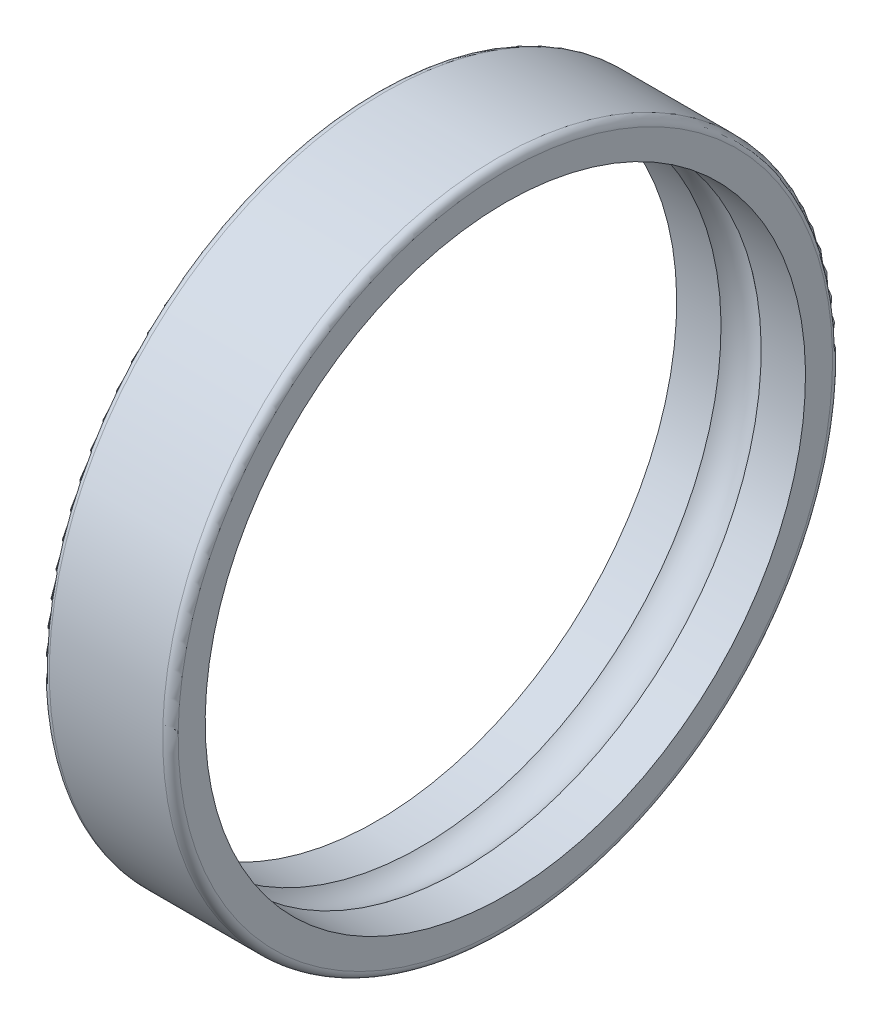
ISO-10303-21;
HEADER;
FILE_DESCRIPTION(('STEP AP214'),'2;1');
FILE_NAME('part.step','',(''),(''),'','','');
FILE_SCHEMA(('AUTOMOTIVE_DESIGN { 1 0 10303 214 1 1 1 1 }'));
ENDSEC;
DATA;
#1=APPLICATION_CONTEXT('core data for automotive mechanical design processes');
#2=APPLICATION_PROTOCOL_DEFINITION('international standard','automotive_design',2000,#1);
#3=PRODUCT_CONTEXT('',#1,'mechanical');
#4=PRODUCT('Part','Part','',(#3));
#5=PRODUCT_RELATED_PRODUCT_CATEGORY('part','',(#4));
#6=PRODUCT_DEFINITION_FORMATION('','',#4);
#7=PRODUCT_DEFINITION_CONTEXT('part definition',#1,'design');
#8=PRODUCT_DEFINITION('design','',#6,#7);
#9=PRODUCT_DEFINITION_SHAPE('','',#8);
#10=(LENGTH_UNIT() NAMED_UNIT(*) SI_UNIT(.MILLI.,.METRE.));
#11=(NAMED_UNIT(*) PLANE_ANGLE_UNIT() SI_UNIT($,.RADIAN.));
#12=(NAMED_UNIT(*) SI_UNIT($,.STERADIAN.) SOLID_ANGLE_UNIT());
#13=UNCERTAINTY_MEASURE_WITH_UNIT(LENGTH_MEASURE(1.E-05),#10,'distance_accuracy_value','');
#14=(GEOMETRIC_REPRESENTATION_CONTEXT(3) GLOBAL_UNCERTAINTY_ASSIGNED_CONTEXT((#13)) GLOBAL_UNIT_ASSIGNED_CONTEXT((#10,
#11,#12)) REPRESENTATION_CONTEXT('',''));
#15=CARTESIAN_POINT('',(0.,0.,0.));
#16=DIRECTION('',(0.,0.,1.));
#17=DIRECTION('',(1.,0.,0.));
#18=AXIS2_PLACEMENT_3D('',#15,#16,#17);
#19=CARTESIAN_POINT('',(4.13964414855096,0.,0.));
#20=DIRECTION('',(-1.,0.,0.));
#21=DIRECTION('',(0.,1.,0.));
#22=AXIS2_PLACEMENT_3D('',#19,#20,#21);
#23=CYLINDRICAL_SURFACE('',#22,11.65);
#24=CARTESIAN_POINT('',(5.,0.,0.));
#25=DIRECTION('',(1.,0.,0.));
#26=DIRECTION('',(0.,1.,0.));
#27=AXIS2_PLACEMENT_3D('',#24,#25,#26);
#28=CIRCLE('',#27,11.65);
#29=CARTESIAN_POINT('',(5.,11.65,0.));
#30=VERTEX_POINT('',#29);
#31=EDGE_CURVE('E11',#30,#30,#28,.T.);
#32=ORIENTED_EDGE('',*,*,#31,.T.);
#33=EDGE_LOOP('',(#32));
#34=FACE_BOUND('',#33,.T.);
#35=CARTESIAN_POINT('',(3.27928829710191,0.,0.));
#36=DIRECTION('',(1.,0.,0.));
#37=DIRECTION('',(0.,1.,0.));
#38=AXIS2_PLACEMENT_3D('',#35,#36,#37);
#39=CIRCLE('',#38,11.65);
#40=CARTESIAN_POINT('',(3.27928829710191,11.65,0.));
#41=VERTEX_POINT('',#40);
#42=EDGE_CURVE('E69',#41,#41,#39,.T.);
#43=ORIENTED_EDGE('',*,*,#42,.F.);
#44=EDGE_LOOP('',(#43));
#45=FACE_BOUND('',#44,.T.);
#46=ADVANCED_FACE('F16',(#34,#45),#23,.F.);
#47=CARTESIAN_POINT('',(5.,12.175,0.));
#48=DIRECTION('',(1.,0.,0.));
#49=DIRECTION('',(0.,1.,0.));
#50=AXIS2_PLACEMENT_3D('',#47,#48,#49);
#51=PLANE('',#50);
#52=CARTESIAN_POINT('',(5.,0.,0.));
#53=DIRECTION('',(1.,0.,0.));
#54=DIRECTION('',(0.,1.,0.));
#55=AXIS2_PLACEMENT_3D('',#52,#53,#54);
#56=CIRCLE('',#55,12.7);
#57=CARTESIAN_POINT('',(5.,12.7,0.));
#58=VERTEX_POINT('',#57);
#59=EDGE_CURVE('E25',#58,#58,#56,.T.);
#60=ORIENTED_EDGE('',*,*,#59,.T.);
#61=EDGE_LOOP('',(#60));
#62=FACE_BOUND('',#61,.T.);
#63=ORIENTED_EDGE('',*,*,#31,.F.);
#64=EDGE_LOOP('',(#63));
#65=FACE_BOUND('',#64,.T.);
#66=ADVANCED_FACE('F86',(#62,#65),#51,.T.);
#67=CARTESIAN_POINT('',(4.7,0.,0.));
#68=DIRECTION('',(1.,0.,0.));
#69=DIRECTION('',(0.,0.,-1.));
#70=AXIS2_PLACEMENT_3D('',#67,#68,#69);
#71=TOROIDAL_SURFACE('',#70,12.7,0.3);
#72=CARTESIAN_POINT('',(4.7,0.,0.));
#73=DIRECTION('',(1.,0.,0.));
#74=DIRECTION('',(0.,1.,0.));
#75=AXIS2_PLACEMENT_3D('',#72,#73,#74);
#76=CIRCLE('',#75,13.);
#77=CARTESIAN_POINT('',(4.7,13.,0.));
#78=VERTEX_POINT('',#77);
#79=EDGE_CURVE('E57',#78,#78,#76,.T.);
#80=ORIENTED_EDGE('',*,*,#79,.T.);
#81=EDGE_LOOP('',(#80));
#82=FACE_BOUND('',#81,.T.);
#83=ORIENTED_EDGE('',*,*,#59,.F.);
#84=EDGE_LOOP('',(#83));
#85=FACE_BOUND('',#84,.T.);
#86=ADVANCED_FACE('F91',(#82,#85),#71,.T.);
#87=CARTESIAN_POINT('',(2.5,0.,0.));
#88=DIRECTION('',(-1.,0.,0.));
#89=DIRECTION('',(0.,1.,0.));
#90=AXIS2_PLACEMENT_3D('',#87,#88,#89);
#91=CYLINDRICAL_SURFACE('',#90,13.);
#92=CARTESIAN_POINT('',(0.3,0.,0.));
#93=DIRECTION('',(1.,0.,0.));
#94=DIRECTION('',(0.,1.,0.));
#95=AXIS2_PLACEMENT_3D('',#92,#93,#94);
#96=CIRCLE('',#95,13.);
#97=CARTESIAN_POINT('',(0.3,13.,0.));
#98=VERTEX_POINT('',#97);
#99=EDGE_CURVE('E19',#98,#98,#96,.T.);
#100=ORIENTED_EDGE('',*,*,#99,.T.);
#101=EDGE_LOOP('',(#100));
#102=FACE_BOUND('',#101,.T.);
#103=ORIENTED_EDGE('',*,*,#79,.F.);
#104=EDGE_LOOP('',(#103));
#105=FACE_BOUND('',#104,.T.);
#106=ADVANCED_FACE('F53',(#102,#105),#91,.T.);
#107=CARTESIAN_POINT('',(0.3,0.,0.));
#108=DIRECTION('',(1.,0.,0.));
#109=DIRECTION('',(0.,0.,-1.));
#110=AXIS2_PLACEMENT_3D('',#107,#108,#109);
#111=TOROIDAL_SURFACE('',#110,12.7,0.3);
#112=CARTESIAN_POINT('',(0.,0.,0.));
#113=DIRECTION('',(1.,0.,0.));
#114=DIRECTION('',(0.,1.,0.));
#115=AXIS2_PLACEMENT_3D('',#112,#113,#114);
#116=CIRCLE('',#115,12.7);
#117=CARTESIAN_POINT('',(0.,12.7,0.));
#118=VERTEX_POINT('',#117);
#119=EDGE_CURVE('E58',#118,#118,#116,.T.);
#120=ORIENTED_EDGE('',*,*,#119,.T.);
#121=EDGE_LOOP('',(#120));
#122=FACE_BOUND('',#121,.T.);
#123=ORIENTED_EDGE('',*,*,#99,.F.);
#124=EDGE_LOOP('',(#123));
#125=FACE_BOUND('',#124,.T.);
#126=ADVANCED_FACE('F102',(#122,#125),#111,.T.);
#127=CARTESIAN_POINT('',(0.,12.175,0.));
#128=DIRECTION('',(-1.,0.,0.));
#129=DIRECTION('',(0.,-1.,0.));
#130=AXIS2_PLACEMENT_3D('',#127,#128,#129);
#131=PLANE('',#130);
#132=CARTESIAN_POINT('',(0.,0.,0.));
#133=DIRECTION('',(1.,0.,0.));
#134=DIRECTION('',(0.,1.,0.));
#135=AXIS2_PLACEMENT_3D('',#132,#133,#134);
#136=CIRCLE('',#135,11.65);
#137=CARTESIAN_POINT('',(0.,11.65,0.));
#138=VERTEX_POINT('',#137);
#139=EDGE_CURVE('E63',#138,#138,#136,.T.);
#140=ORIENTED_EDGE('',*,*,#139,.T.);
#141=EDGE_LOOP('',(#140));
#142=FACE_BOUND('',#141,.T.);
#143=ORIENTED_EDGE('',*,*,#119,.F.);
#144=EDGE_LOOP('',(#143));
#145=FACE_BOUND('',#144,.T.);
#146=ADVANCED_FACE('F105',(#142,#145),#131,.T.);
#147=CARTESIAN_POINT('',(0.860355851449044,0.,0.));
#148=DIRECTION('',(-1.,0.,0.));
#149=DIRECTION('',(0.,1.,0.));
#150=AXIS2_PLACEMENT_3D('',#147,#148,#149);
#151=CYLINDRICAL_SURFACE('',#150,11.65);
#152=CARTESIAN_POINT('',(1.72071170289809,0.,0.));
#153=DIRECTION('',(1.,0.,0.));
#154=DIRECTION('',(0.,1.,0.));
#155=AXIS2_PLACEMENT_3D('',#152,#153,#154);
#156=CIRCLE('',#155,11.65);
#157=CARTESIAN_POINT('',(1.72071170289809,11.65,0.));
#158=VERTEX_POINT('',#157);
#159=EDGE_CURVE('E72',#158,#158,#156,.T.);
#160=ORIENTED_EDGE('',*,*,#159,.T.);
#161=EDGE_LOOP('',(#160));
#162=FACE_BOUND('',#161,.T.);
#163=ORIENTED_EDGE('',*,*,#139,.F.);
#164=EDGE_LOOP('',(#163));
#165=FACE_BOUND('',#164,.T.);
#166=ADVANCED_FACE('F101',(#162,#165),#151,.F.);
#167=CARTESIAN_POINT('',(2.5,0.,0.));
#168=DIRECTION('',(1.,0.,0.));
#169=DIRECTION('',(0.,0.,-1.));
#170=AXIS2_PLACEMENT_3D('',#167,#168,#169);
#171=TOROIDAL_SURFACE('',#170,10.75,1.1905);
#172=ORIENTED_EDGE('',*,*,#42,.T.);
#173=EDGE_LOOP('',(#172));
#174=FACE_BOUND('',#173,.T.);
#175=ORIENTED_EDGE('',*,*,#159,.F.);
#176=EDGE_LOOP('',(#175));
#177=FACE_BOUND('',#176,.T.);
#178=ADVANCED_FACE('F82',(#174,#177),#171,.F.);
#179=CLOSED_SHELL('',(#46,#66,#86,#106,#126,#146,#166,#178));
#180=MANIFOLD_SOLID_BREP('B1',#179);
#181=ADVANCED_BREP_SHAPE_REPRESENTATION('',(#18,#180),#14);
#182=SHAPE_DEFINITION_REPRESENTATION(#9,#181);
ENDSEC;
END-ISO-10303-21;
